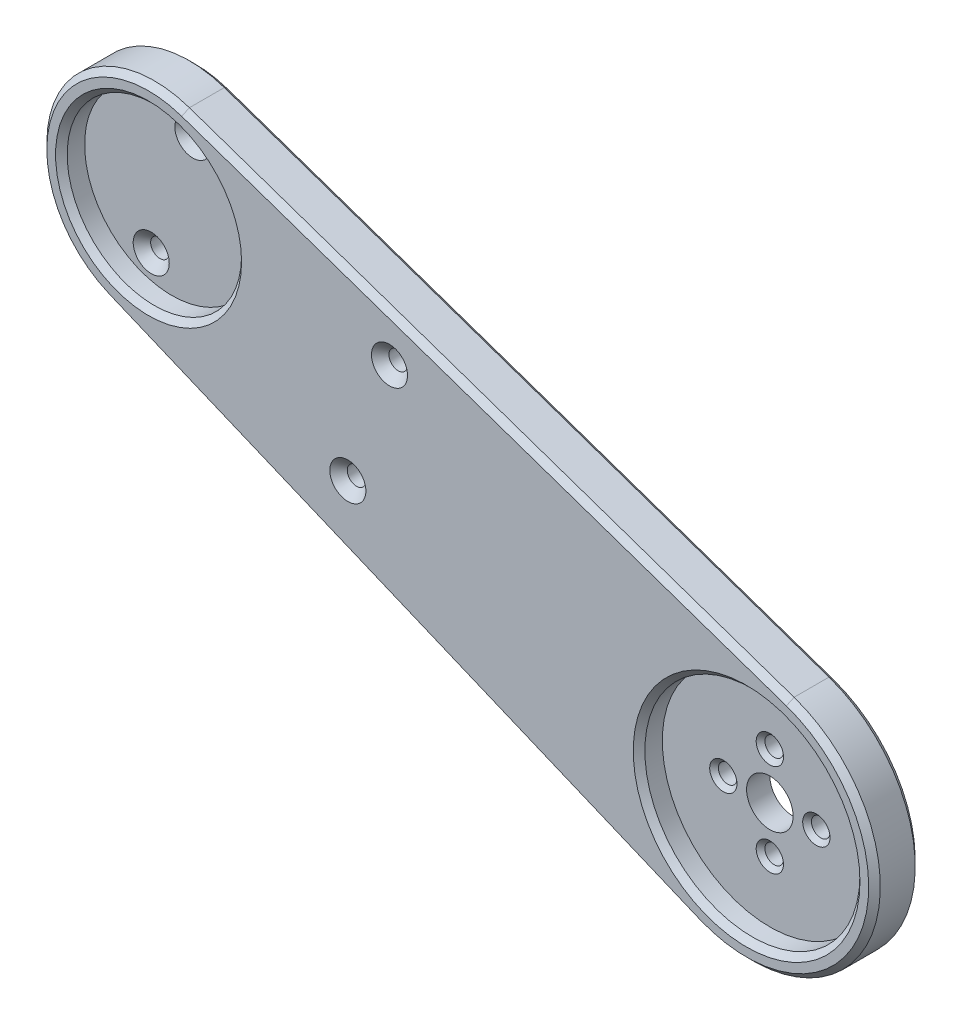
ISO-10303-21;
HEADER;
FILE_DESCRIPTION(('STEP AP214'),'2;1');
FILE_NAME('part.step','',(''),(''),'','','');
FILE_SCHEMA(('AUTOMOTIVE_DESIGN { 1 0 10303 214 1 1 1 1 }'));
ENDSEC;
DATA;
#1=APPLICATION_CONTEXT('core data for automotive mechanical design processes');
#2=APPLICATION_PROTOCOL_DEFINITION('international standard','automotive_design',2000,#1);
#3=PRODUCT_CONTEXT('',#1,'mechanical');
#4=PRODUCT('Part','Part','',(#3));
#5=PRODUCT_RELATED_PRODUCT_CATEGORY('part','',(#4));
#6=PRODUCT_DEFINITION_FORMATION('','',#4);
#7=PRODUCT_DEFINITION_CONTEXT('part definition',#1,'design');
#8=PRODUCT_DEFINITION('design','',#6,#7);
#9=PRODUCT_DEFINITION_SHAPE('','',#8);
#10=(LENGTH_UNIT() NAMED_UNIT(*) SI_UNIT(.MILLI.,.METRE.));
#11=(NAMED_UNIT(*) PLANE_ANGLE_UNIT() SI_UNIT($,.RADIAN.));
#12=(NAMED_UNIT(*) SI_UNIT($,.STERADIAN.) SOLID_ANGLE_UNIT());
#13=UNCERTAINTY_MEASURE_WITH_UNIT(LENGTH_MEASURE(1.E-05),#10,'distance_accuracy_value','');
#14=(GEOMETRIC_REPRESENTATION_CONTEXT(3) GLOBAL_UNCERTAINTY_ASSIGNED_CONTEXT((#13)) GLOBAL_UNIT_ASSIGNED_CONTEXT((#10,
#11,#12)) REPRESENTATION_CONTEXT('',''));
#15=CARTESIAN_POINT('',(0.,0.,0.));
#16=DIRECTION('',(0.,0.,1.));
#17=DIRECTION('',(1.,0.,0.));
#18=AXIS2_PLACEMENT_3D('',#15,#16,#17);
#19=CARTESIAN_POINT('',(0.,0.,8.));
#20=DIRECTION('',(0.,0.,1.));
#21=DIRECTION('',(1.,0.,0.));
#22=AXIS2_PLACEMENT_3D('',#19,#20,#21);
#23=PLANE('',#22);
#24=CARTESIAN_POINT('',(-78.1246934483278,29.8218290529631,8.));
#25=DIRECTION('',(0.,0.,1.));
#26=DIRECTION('',(1.,0.,0.));
#27=AXIS2_PLACEMENT_3D('',#24,#25,#26);
#28=CIRCLE('',#27,17.5);
#29=CARTESIAN_POINT('',(-72.4259671731648,46.3679621009222,8.));
#30=VERTEX_POINT('',#29);
#31=CARTESIAN_POINT('',(-84.863763479043,13.6714440692819,8.));
#32=VERTEX_POINT('',#31);
#33=EDGE_CURVE('E48',#30,#32,#28,.T.);
#34=ORIENTED_EDGE('',*,*,#33,.T.);
#35=DIRECTION('',(0.922879141924641,-0.38508971604087,0.));
#36=VECTOR('',#35,1.);
#37=CARTESIAN_POINT('',(16.6529421326675,-28.6884246952139,8.));
#38=LINE('',#37,#36);
#39=CARTESIAN_POINT('',(16.6529421326675,-28.6884246952139,8.));
#40=VERTEX_POINT('',#39);
#41=EDGE_CURVE('E11',#32,#40,#38,.T.);
#42=ORIENTED_EDGE('',*,*,#41,.T.);
#43=CARTESIAN_POINT('',(24.7398261695258,-9.3079627147964,8.));
#44=DIRECTION('',(0.,0.,1.));
#45=DIRECTION('',(1.,0.,0.));
#46=AXIS2_PLACEMENT_3D('',#43,#44,#45);
#47=CIRCLE('',#46,21.);
#48=CARTESIAN_POINT('',(31.5782976997214,10.5473969427546,8.));
#49=VERTEX_POINT('',#48);
#50=EDGE_CURVE('E137',#40,#49,#47,.T.);
#51=ORIENTED_EDGE('',*,*,#50,.T.);
#52=DIRECTION('',(-0.945493317026238,0.325641501437888,0.));
#53=VECTOR('',#52,1.);
#54=CARTESIAN_POINT('',(6.59609577821989,19.151626709845,8.));
#55=LINE('',#54,#53);
#56=EDGE_CURVE('E287',#49,#30,#55,.T.);
#57=ORIENTED_EDGE('',*,*,#56,.T.);
#58=EDGE_LOOP('',(#34,#42,#51,#57));
#59=FACE_BOUND('',#58,.T.);
#60=CARTESIAN_POINT('',(-36.6830568776465,27.1828714738999,8.));
#61=DIRECTION('',(0.,0.,1.));
#62=DIRECTION('',(1.,0.,0.));
#63=AXIS2_PLACEMENT_3D('',#60,#61,#62);
#64=CIRCLE('',#63,3.10000000000003);
#65=CARTESIAN_POINT('',(-33.5830568776465,27.1828714738999,8.));
#66=VERTEX_POINT('',#65);
#67=EDGE_CURVE('E261',#66,#66,#64,.F.);
#68=ORIENTED_EDGE('',*,*,#67,.T.);
#69=EDGE_LOOP('',(#68));
#70=FACE_BOUND('',#69,.T.);
#71=CARTESIAN_POINT('',(-43.84716990928,6.38201849932264,8.));
#72=DIRECTION('',(0.,0.,1.));
#73=DIRECTION('',(1.,0.,0.));
#74=AXIS2_PLACEMENT_3D('',#71,#72,#73);
#75=CIRCLE('',#74,3.10000000000001);
#76=CARTESIAN_POINT('',(-40.74716990928,6.38201849932264,8.));
#77=VERTEX_POINT('',#76);
#78=EDGE_CURVE('E258',#77,#77,#75,.F.);
#79=ORIENTED_EDGE('',*,*,#78,.T.);
#80=EDGE_LOOP('',(#79));
#81=FACE_BOUND('',#80,.T.);
#82=CARTESIAN_POINT('',(-78.1246934483278,29.8218290529631,8.));
#83=DIRECTION('',(0.,0.,1.));
#84=DIRECTION('',(1.,0.,0.));
#85=AXIS2_PLACEMENT_3D('',#82,#83,#84);
#86=CIRCLE('',#85,16.);
#87=CARTESIAN_POINT('',(-62.1246934483278,29.8218290529631,8.));
#88=VERTEX_POINT('',#87);
#89=EDGE_CURVE('E231',#88,#88,#86,.F.);
#90=ORIENTED_EDGE('',*,*,#89,.T.);
#91=EDGE_LOOP('',(#90));
#92=FACE_BOUND('',#91,.T.);
#93=CARTESIAN_POINT('',(24.7398261695258,-9.3079627147964,8.));
#94=DIRECTION('',(0.,0.,1.));
#95=DIRECTION('',(1.,0.,0.));
#96=AXIS2_PLACEMENT_3D('',#93,#94,#95);
#97=CIRCLE('',#96,19.5);
#98=CARTESIAN_POINT('',(44.2398261695258,-9.3079627147964,8.));
#99=VERTEX_POINT('',#98);
#100=EDGE_CURVE('E234',#99,#99,#97,.F.);
#101=ORIENTED_EDGE('',*,*,#100,.T.);
#102=EDGE_LOOP('',(#101));
#103=FACE_BOUND('',#102,.T.);
#104=ADVANCED_FACE('F38',(#59,#70,#81,#92,#103),#23,.T.);
#105=CARTESIAN_POINT('',(0.,0.,0.));
#106=DIRECTION('',(0.,0.,1.));
#107=DIRECTION('',(1.,0.,0.));
#108=AXIS2_PLACEMENT_3D('',#105,#106,#107);
#109=PLANE('',#108);
#110=CARTESIAN_POINT('',(24.7398261695258,-9.3079627147964,0.));
#111=DIRECTION('',(0.,0.,1.));
#112=DIRECTION('',(1.,0.,0.));
#113=AXIS2_PLACEMENT_3D('',#110,#111,#112);
#114=CIRCLE('',#113,21.);
#115=CARTESIAN_POINT('',(31.5782976997214,10.5473969427546,0.));
#116=VERTEX_POINT('',#115);
#117=CARTESIAN_POINT('',(16.6529421326675,-28.6884246952139,0.));
#118=VERTEX_POINT('',#117);
#119=EDGE_CURVE('E272',#116,#118,#114,.F.);
#120=ORIENTED_EDGE('',*,*,#119,.T.);
#121=DIRECTION('',(-0.922879141924641,0.38508971604087,0.));
#122=VECTOR('',#121,1.);
#123=CARTESIAN_POINT('',(-7.72608270276659,-18.5157906798303,0.));
#124=LINE('',#123,#122);
#125=CARTESIAN_POINT('',(-84.8637634790431,13.6714440692818,0.));
#126=VERTEX_POINT('',#125);
#127=EDGE_CURVE('E276',#118,#126,#124,.T.);
#128=ORIENTED_EDGE('',*,*,#127,.T.);
#129=CARTESIAN_POINT('',(-78.1246934483278,29.8218290529631,0.));
#130=DIRECTION('',(0.,0.,1.));
#131=DIRECTION('',(1.,0.,0.));
#132=AXIS2_PLACEMENT_3D('',#129,#130,#131);
#133=CIRCLE('',#132,17.5);
#134=CARTESIAN_POINT('',(-72.4259671731648,46.3679621009223,0.));
#135=VERTEX_POINT('',#134);
#136=EDGE_CURVE('E274',#126,#135,#133,.F.);
#137=ORIENTED_EDGE('',*,*,#136,.T.);
#138=DIRECTION('',(0.945493317026238,-0.325641501437888,0.));
#139=VECTOR('',#138,1.);
#140=CARTESIAN_POINT('',(31.5782976997214,10.5473969427546,0.));
#141=LINE('',#140,#139);
#142=EDGE_CURVE('E270',#135,#116,#141,.T.);
#143=ORIENTED_EDGE('',*,*,#142,.T.);
#144=EDGE_LOOP('',(#120,#128,#137,#143));
#145=FACE_BOUND('',#144,.T.);
#146=CARTESIAN_POINT('',(-74.502789558696,40.2085315314155,0.));
#147=DIRECTION('',(0.,0.,1.));
#148=DIRECTION('',(1.,0.,0.));
#149=AXIS2_PLACEMENT_3D('',#146,#147,#148);
#150=CIRCLE('',#149,1.6);
#151=CARTESIAN_POINT('',(-72.902789558696,40.2085315314155,0.));
#152=VERTEX_POINT('',#151);
#153=EDGE_CURVE('E168',#152,#152,#150,.T.);
#154=ORIENTED_EDGE('',*,*,#153,.T.);
#155=EDGE_LOOP('',(#154));
#156=FACE_BOUND('',#155,.T.);
#157=CARTESIAN_POINT('',(-43.84716990928,6.38201849932264,0.));
#158=DIRECTION('',(0.,0.,1.));
#159=DIRECTION('',(1.,0.,0.));
#160=AXIS2_PLACEMENT_3D('',#157,#158,#159);
#161=CIRCLE('',#160,1.6);
#162=CARTESIAN_POINT('',(-42.24716990928,6.38201849932264,0.));
#163=VERTEX_POINT('',#162);
#164=EDGE_CURVE('E173',#163,#163,#161,.T.);
#165=ORIENTED_EDGE('',*,*,#164,.T.);
#166=EDGE_LOOP('',(#165));
#167=FACE_BOUND('',#166,.T.);
#168=CARTESIAN_POINT('',(24.7398261695258,-9.3079627147964,0.));
#169=DIRECTION('',(0.,0.,-1.));
#170=DIRECTION('',(-1.,0.,0.));
#171=AXIS2_PLACEMENT_3D('',#168,#169,#170);
#172=CIRCLE('',#171,4.00000000000001);
#173=CARTESIAN_POINT('',(20.7398261695258,-9.3079627147964,0.));
#174=VERTEX_POINT('',#173);
#175=EDGE_CURVE('E176',#174,#174,#172,.T.);
#176=ORIENTED_EDGE('',*,*,#175,.F.);
#177=EDGE_LOOP('',(#176));
#178=FACE_BOUND('',#177,.T.);
#179=CARTESIAN_POINT('',(24.7398261695258,-1.3079627147964,0.));
#180=DIRECTION('',(0.,0.,1.));
#181=DIRECTION('',(1.,0.,0.));
#182=AXIS2_PLACEMENT_3D('',#179,#180,#181);
#183=CIRCLE('',#182,1.6);
#184=CARTESIAN_POINT('',(26.3398261695258,-1.3079627147964,0.));
#185=VERTEX_POINT('',#184);
#186=EDGE_CURVE('E181',#185,#185,#183,.T.);
#187=ORIENTED_EDGE('',*,*,#186,.T.);
#188=EDGE_LOOP('',(#187));
#189=FACE_BOUND('',#188,.T.);
#190=CARTESIAN_POINT('',(16.7398261695258,-9.30796271479641,0.));
#191=DIRECTION('',(0.,0.,1.));
#192=DIRECTION('',(1.,0.,0.));
#193=AXIS2_PLACEMENT_3D('',#190,#191,#192);
#194=CIRCLE('',#193,1.6);
#195=CARTESIAN_POINT('',(18.3398261695258,-9.30796271479641,0.));
#196=VERTEX_POINT('',#195);
#197=EDGE_CURVE('E184',#196,#196,#194,.T.);
#198=ORIENTED_EDGE('',*,*,#197,.T.);
#199=EDGE_LOOP('',(#198));
#200=FACE_BOUND('',#199,.T.);
#201=CARTESIAN_POINT('',(32.7398261695258,-9.3079627147964,0.));
#202=DIRECTION('',(0.,0.,1.));
#203=DIRECTION('',(1.,0.,0.));
#204=AXIS2_PLACEMENT_3D('',#201,#202,#203);
#205=CIRCLE('',#204,1.60000000000001);
#206=CARTESIAN_POINT('',(34.3398261695258,-9.3079627147964,0.));
#207=VERTEX_POINT('',#206);
#208=EDGE_CURVE('E187',#207,#207,#205,.T.);
#209=ORIENTED_EDGE('',*,*,#208,.T.);
#210=EDGE_LOOP('',(#209));
#211=FACE_BOUND('',#210,.T.);
#212=CARTESIAN_POINT('',(24.7398261695258,-17.3079627147964,0.));
#213=DIRECTION('',(0.,0.,1.));
#214=DIRECTION('',(1.,0.,0.));
#215=AXIS2_PLACEMENT_3D('',#212,#213,#214);
#216=CIRCLE('',#215,1.6);
#217=CARTESIAN_POINT('',(26.3398261695258,-17.3079627147964,0.));
#218=VERTEX_POINT('',#217);
#219=EDGE_CURVE('E190',#218,#218,#216,.T.);
#220=ORIENTED_EDGE('',*,*,#219,.T.);
#221=EDGE_LOOP('',(#220));
#222=FACE_BOUND('',#221,.T.);
#223=CARTESIAN_POINT('',(-81.6669025903295,19.4076785568382,0.));
#224=DIRECTION('',(0.,0.,1.));
#225=DIRECTION('',(1.,0.,0.));
#226=AXIS2_PLACEMENT_3D('',#223,#224,#225);
#227=CIRCLE('',#226,1.6);
#228=CARTESIAN_POINT('',(-80.0669025903295,19.4076785568382,0.));
#229=VERTEX_POINT('',#228);
#230=EDGE_CURVE('E162',#229,#229,#227,.F.);
#231=ORIENTED_EDGE('',*,*,#230,.F.);
#232=EDGE_LOOP('',(#231));
#233=FACE_BOUND('',#232,.T.);
#234=CARTESIAN_POINT('',(-36.6830568776465,27.1828714738999,0.));
#235=DIRECTION('',(0.,0.,1.));
#236=DIRECTION('',(1.,0.,0.));
#237=AXIS2_PLACEMENT_3D('',#234,#235,#236);
#238=CIRCLE('',#237,1.6);
#239=CARTESIAN_POINT('',(-35.0830568776465,27.1828714738999,0.));
#240=VERTEX_POINT('',#239);
#241=EDGE_CURVE('E180',#240,#240,#238,.F.);
#242=ORIENTED_EDGE('',*,*,#241,.F.);
#243=EDGE_LOOP('',(#242));
#244=FACE_BOUND('',#243,.T.);
#245=ADVANCED_FACE('F317',(#145,#156,#167,#178,#189,#200,#211,#222,#233,#244),#109,.F.);
#246=CARTESIAN_POINT('',(0.,0.,4.));
#247=DIRECTION('',(0.,0.,1.));
#248=DIRECTION('',(1.,0.,0.));
#249=AXIS2_PLACEMENT_3D('',#246,#247,#248);
#250=PLANE('',#249);
#251=CARTESIAN_POINT('',(-74.502789558696,40.2085315314155,4.));
#252=DIRECTION('',(0.,0.,1.));
#253=DIRECTION('',(1.,0.,0.));
#254=AXIS2_PLACEMENT_3D('',#251,#252,#253);
#255=CIRCLE('',#254,3.10000000000002);
#256=CARTESIAN_POINT('',(-71.4027895586959,40.2085315314155,4.));
#257=VERTEX_POINT('',#256);
#258=EDGE_CURVE('E252',#257,#257,#255,.F.);
#259=ORIENTED_EDGE('',*,*,#258,.T.);
#260=EDGE_LOOP('',(#259));
#261=FACE_BOUND('',#260,.T.);
#262=CARTESIAN_POINT('',(-81.6669025903295,19.4076785568382,4.));
#263=DIRECTION('',(0.,0.,1.));
#264=DIRECTION('',(1.,0.,0.));
#265=AXIS2_PLACEMENT_3D('',#262,#263,#264);
#266=CIRCLE('',#265,3.10000000000001);
#267=CARTESIAN_POINT('',(-78.5669025903295,19.4076785568382,4.));
#268=VERTEX_POINT('',#267);
#269=EDGE_CURVE('E249',#268,#268,#266,.F.);
#270=ORIENTED_EDGE('',*,*,#269,.T.);
#271=EDGE_LOOP('',(#270));
#272=FACE_BOUND('',#271,.T.);
#273=CARTESIAN_POINT('',(-78.1246934483278,29.8218290529631,4.));
#274=DIRECTION('',(0.,0.,1.));
#275=DIRECTION('',(1.,0.,0.));
#276=AXIS2_PLACEMENT_3D('',#273,#274,#275);
#277=CIRCLE('',#276,15.);
#278=CARTESIAN_POINT('',(-63.1246934483278,29.8218290529631,4.));
#279=VERTEX_POINT('',#278);
#280=EDGE_CURVE('E201',#279,#279,#277,.T.);
#281=ORIENTED_EDGE('',*,*,#280,.T.);
#282=EDGE_LOOP('',(#281));
#283=FACE_BOUND('',#282,.T.);
#284=ADVANCED_FACE('F322',(#261,#272,#283),#250,.T.);
#285=CARTESIAN_POINT('',(-8.11117241880745,-19.4386698217549,8.));
#286=DIRECTION('',(0.38508971604087,0.922879141924641,0.));
#287=DIRECTION('',(-0.922879141924641,0.38508971604087,0.));
#288=AXIS2_PLACEMENT_3D('',#285,#286,#287);
#289=PLANE('',#288);
#290=DIRECTION('',(0.,0.,-1.));
#291=VECTOR('',#290,1.);
#292=CARTESIAN_POINT('',(-85.2488531950839,12.7485649273572,8.));
#293=LINE('',#292,#291);
#294=CARTESIAN_POINT('',(-85.2488531950839,12.7485649273572,6.99999999999999));
#295=VERTEX_POINT('',#294);
#296=CARTESIAN_POINT('',(-85.2488531950839,12.7485649273572,0.999999999999973));
#297=VERTEX_POINT('',#296);
#298=EDGE_CURVE('E193',#295,#297,#293,.T.);
#299=ORIENTED_EDGE('',*,*,#298,.T.);
#300=DIRECTION('',(0.922879141924641,-0.38508971604087,0.));
#301=VECTOR('',#300,1.);
#302=CARTESIAN_POINT('',(-8.11117241880745,-19.4386698217549,0.999999999999975));
#303=LINE('',#302,#301);
#304=CARTESIAN_POINT('',(16.2678524166266,-29.6113038371385,0.999999999999973));
#305=VERTEX_POINT('',#304);
#306=EDGE_CURVE('E128',#297,#305,#303,.T.);
#307=ORIENTED_EDGE('',*,*,#306,.T.);
#308=DIRECTION('',(0.,0.,-1.));
#309=VECTOR('',#308,1.);
#310=CARTESIAN_POINT('',(16.2678524166266,-29.6113038371385,8.));
#311=LINE('',#310,#309);
#312=CARTESIAN_POINT('',(16.2678524166266,-29.6113038371385,6.99999999999999));
#313=VERTEX_POINT('',#312);
#314=EDGE_CURVE('E111',#313,#305,#311,.T.);
#315=ORIENTED_EDGE('',*,*,#314,.F.);
#316=DIRECTION('',(-0.922879141924641,0.38508971604087,0.));
#317=VECTOR('',#316,1.);
#318=CARTESIAN_POINT('',(-85.2488531950839,12.7485649273572,6.99999999999998));
#319=LINE('',#318,#317);
#320=EDGE_CURVE('E125',#313,#295,#319,.T.);
#321=ORIENTED_EDGE('',*,*,#320,.T.);
#322=EDGE_LOOP('',(#299,#307,#315,#321));
#323=FACE_BOUND('',#322,.T.);
#324=ADVANCED_FACE('F124',(#323),#289,.F.);
#325=CARTESIAN_POINT('',(24.7398261695258,-9.3079627147964,8.));
#326=DIRECTION('',(0.,0.,-1.));
#327=DIRECTION('',(-1.,0.,0.));
#328=AXIS2_PLACEMENT_3D('',#325,#326,#327);
#329=CYLINDRICAL_SURFACE('',#328,22.);
#330=ORIENTED_EDGE('',*,*,#314,.T.);
#331=CARTESIAN_POINT('',(24.7398261695258,-9.3079627147964,0.999999999999973));
#332=DIRECTION('',(0.,0.,1.));
#333=DIRECTION('',(1.,0.,0.));
#334=AXIS2_PLACEMENT_3D('',#331,#332,#333);
#335=CIRCLE('',#334,22.);
#336=CARTESIAN_POINT('',(31.9039392011593,11.4928902597808,0.999999999999973));
#337=VERTEX_POINT('',#336);
#338=EDGE_CURVE('E117',#305,#337,#335,.T.);
#339=ORIENTED_EDGE('',*,*,#338,.T.);
#340=DIRECTION('',(0.,0.,-1.));
#341=VECTOR('',#340,1.);
#342=CARTESIAN_POINT('',(31.9039392011593,11.4928902597808,8.));
#343=LINE('',#342,#341);
#344=CARTESIAN_POINT('',(31.9039392011593,11.4928902597808,6.99999999999998));
#345=VERTEX_POINT('',#344);
#346=EDGE_CURVE('E113',#345,#337,#343,.T.);
#347=ORIENTED_EDGE('',*,*,#346,.F.);
#348=CARTESIAN_POINT('',(24.7398261695258,-9.3079627147964,6.99999999999999));
#349=DIRECTION('',(0.,0.,1.));
#350=DIRECTION('',(1.,0.,0.));
#351=AXIS2_PLACEMENT_3D('',#348,#349,#350);
#352=CIRCLE('',#351,22.);
#353=EDGE_CURVE('E108',#345,#313,#352,.F.);
#354=ORIENTED_EDGE('',*,*,#353,.T.);
#355=EDGE_LOOP('',(#330,#339,#347,#354));
#356=FACE_BOUND('',#355,.T.);
#357=ADVANCED_FACE('F110',(#356),#329,.T.);
#358=CARTESIAN_POINT('',(6.92173727965778,20.0971200268713,8.));
#359=DIRECTION('',(0.325641501437888,0.945493317026238,0.));
#360=DIRECTION('',(-0.945493317026238,0.325641501437888,0.));
#361=AXIS2_PLACEMENT_3D('',#358,#359,#360);
#362=PLANE('',#361);
#363=ORIENTED_EDGE('',*,*,#346,.T.);
#364=DIRECTION('',(-0.945493317026238,0.325641501437888,0.));
#365=VECTOR('',#364,1.);
#366=CARTESIAN_POINT('',(-72.1003256717269,47.3134554179485,0.999999999999973));
#367=LINE('',#366,#365);
#368=CARTESIAN_POINT('',(-72.1003256717269,47.3134554179485,0.999999999999973));
#369=VERTEX_POINT('',#368);
#370=EDGE_CURVE('E285',#337,#369,#367,.T.);
#371=ORIENTED_EDGE('',*,*,#370,.T.);
#372=DIRECTION('',(0.,0.,-1.));
#373=VECTOR('',#372,1.);
#374=CARTESIAN_POINT('',(-72.1003256717269,47.3134554179485,8.));
#375=LINE('',#374,#373);
#376=CARTESIAN_POINT('',(-72.1003256717269,47.3134554179485,6.99999999999998));
#377=VERTEX_POINT('',#376);
#378=EDGE_CURVE('E195',#377,#369,#375,.T.);
#379=ORIENTED_EDGE('',*,*,#378,.F.);
#380=DIRECTION('',(0.945493317026238,-0.325641501437888,0.));
#381=VECTOR('',#380,1.);
#382=CARTESIAN_POINT('',(6.92173727965778,20.0971200268713,6.99999999999998));
#383=LINE('',#382,#381);
#384=EDGE_CURVE('E283',#377,#345,#383,.T.);
#385=ORIENTED_EDGE('',*,*,#384,.T.);
#386=EDGE_LOOP('',(#363,#371,#379,#385));
#387=FACE_BOUND('',#386,.T.);
#388=ADVANCED_FACE('F298',(#387),#362,.T.);
#389=CARTESIAN_POINT('',(24.7398261695258,-9.3079627147964,8.));
#390=DIRECTION('',(0.,0.,-1.));
#391=DIRECTION('',(-1.,0.,0.));
#392=AXIS2_PLACEMENT_3D('',#389,#390,#391);
#393=CYLINDRICAL_SURFACE('',#392,18.5);
#394=CARTESIAN_POINT('',(24.7398261695258,-9.3079627147964,6.99999999999998));
#395=DIRECTION('',(0.,0.,1.));
#396=DIRECTION('',(1.,0.,0.));
#397=AXIS2_PLACEMENT_3D('',#394,#395,#396);
#398=CIRCLE('',#397,18.5);
#399=CARTESIAN_POINT('',(43.2398261695258,-9.3079627147964,6.99999999999998));
#400=VERTEX_POINT('',#399);
#401=EDGE_CURVE('E228',#400,#400,#398,.T.);
#402=ORIENTED_EDGE('',*,*,#401,.T.);
#403=EDGE_LOOP('',(#402));
#404=FACE_BOUND('',#403,.T.);
#405=CARTESIAN_POINT('',(24.7398261695258,-9.3079627147964,4.));
#406=DIRECTION('',(0.,0.,1.));
#407=DIRECTION('',(1.,0.,0.));
#408=AXIS2_PLACEMENT_3D('',#405,#406,#407);
#409=CIRCLE('',#408,18.5);
#410=CARTESIAN_POINT('',(43.2398261695258,-9.3079627147964,4.));
#411=VERTEX_POINT('',#410);
#412=EDGE_CURVE('E129',#411,#411,#409,.T.);
#413=ORIENTED_EDGE('',*,*,#412,.F.);
#414=EDGE_LOOP('',(#413));
#415=FACE_BOUND('',#414,.T.);
#416=ADVANCED_FACE('F335',(#404,#415),#393,.F.);
#417=CARTESIAN_POINT('',(-78.1246934483278,29.8218290529631,8.));
#418=DIRECTION('',(0.,0.,-1.));
#419=DIRECTION('',(-1.,0.,0.));
#420=AXIS2_PLACEMENT_3D('',#417,#418,#419);
#421=CYLINDRICAL_SURFACE('',#420,15.);
#422=CARTESIAN_POINT('',(-78.1246934483278,29.8218290529631,6.99999999999999));
#423=DIRECTION('',(0.,0.,1.));
#424=DIRECTION('',(1.,0.,0.));
#425=AXIS2_PLACEMENT_3D('',#422,#423,#424);
#426=CIRCLE('',#425,15.);
#427=CARTESIAN_POINT('',(-63.1246934483278,29.8218290529631,6.99999999999999));
#428=VERTEX_POINT('',#427);
#429=EDGE_CURVE('E237',#428,#428,#426,.T.);
#430=ORIENTED_EDGE('',*,*,#429,.T.);
#431=EDGE_LOOP('',(#430));
#432=FACE_BOUND('',#431,.T.);
#433=ORIENTED_EDGE('',*,*,#280,.F.);
#434=EDGE_LOOP('',(#433));
#435=FACE_BOUND('',#434,.T.);
#436=ADVANCED_FACE('F332',(#432,#435),#421,.F.);
#437=CARTESIAN_POINT('',(-78.1246934483278,29.8218290529631,8.));
#438=DIRECTION('',(0.,0.,-1.));
#439=DIRECTION('',(-1.,0.,0.));
#440=AXIS2_PLACEMENT_3D('',#437,#438,#439);
#441=CYLINDRICAL_SURFACE('',#440,18.5);
#442=ORIENTED_EDGE('',*,*,#378,.T.);
#443=CARTESIAN_POINT('',(-78.1246934483278,29.8218290529631,0.999999999999973));
#444=DIRECTION('',(0.,0.,1.));
#445=DIRECTION('',(1.,0.,0.));
#446=AXIS2_PLACEMENT_3D('',#443,#444,#445);
#447=CIRCLE('',#446,18.5);
#448=EDGE_CURVE('E118',#369,#297,#447,.T.);
#449=ORIENTED_EDGE('',*,*,#448,.T.);
#450=ORIENTED_EDGE('',*,*,#298,.F.);
#451=CARTESIAN_POINT('',(-78.1246934483278,29.8218290529631,6.99999999999999));
#452=DIRECTION('',(0.,0.,1.));
#453=DIRECTION('',(1.,0.,0.));
#454=AXIS2_PLACEMENT_3D('',#451,#452,#453);
#455=CIRCLE('',#454,18.5);
#456=EDGE_CURVE('E279',#295,#377,#455,.F.);
#457=ORIENTED_EDGE('',*,*,#456,.T.);
#458=EDGE_LOOP('',(#442,#449,#450,#457));
#459=FACE_BOUND('',#458,.T.);
#460=ADVANCED_FACE('F296',(#459),#441,.T.);
#461=CARTESIAN_POINT('',(24.7398261695258,-17.3079627147964,4.));
#462=DIRECTION('',(0.,0.,-1.));
#463=DIRECTION('',(-1.,0.,0.));
#464=AXIS2_PLACEMENT_3D('',#461,#462,#463);
#465=CYLINDRICAL_SURFACE('',#464,1.6);
#466=CARTESIAN_POINT('',(24.7398261695258,-17.3079627147964,3.24999999999998));
#467=DIRECTION('',(0.,0.,1.));
#468=DIRECTION('',(1.,0.,0.));
#469=AXIS2_PLACEMENT_3D('',#466,#467,#468);
#470=CIRCLE('',#469,1.6);
#471=CARTESIAN_POINT('',(26.3398261695258,-17.3079627147964,3.24999999999998));
#472=VERTEX_POINT('',#471);
#473=EDGE_CURVE('E219',#472,#472,#470,.T.);
#474=ORIENTED_EDGE('',*,*,#473,.T.);
#475=EDGE_LOOP('',(#474));
#476=FACE_BOUND('',#475,.T.);
#477=ORIENTED_EDGE('',*,*,#219,.F.);
#478=EDGE_LOOP('',(#477));
#479=FACE_BOUND('',#478,.T.);
#480=ADVANCED_FACE('F331',(#476,#479),#465,.F.);
#481=CARTESIAN_POINT('',(32.7398261695258,-9.3079627147964,4.));
#482=DIRECTION('',(0.,0.,-1.));
#483=DIRECTION('',(-1.,0.,0.));
#484=AXIS2_PLACEMENT_3D('',#481,#482,#483);
#485=CYLINDRICAL_SURFACE('',#484,1.60000000000001);
#486=CARTESIAN_POINT('',(32.7398261695258,-9.3079627147964,3.24999999999999));
#487=DIRECTION('',(0.,0.,1.));
#488=DIRECTION('',(1.,0.,0.));
#489=AXIS2_PLACEMENT_3D('',#486,#487,#488);
#490=CIRCLE('',#489,1.60000000000001);
#491=CARTESIAN_POINT('',(34.3398261695258,-9.3079627147964,3.24999999999999));
#492=VERTEX_POINT('',#491);
#493=EDGE_CURVE('E222',#492,#492,#490,.T.);
#494=ORIENTED_EDGE('',*,*,#493,.T.);
#495=EDGE_LOOP('',(#494));
#496=FACE_BOUND('',#495,.T.);
#497=ORIENTED_EDGE('',*,*,#208,.F.);
#498=EDGE_LOOP('',(#497));
#499=FACE_BOUND('',#498,.T.);
#500=ADVANCED_FACE('F442',(#496,#499),#485,.F.);
#501=CARTESIAN_POINT('',(16.7398261695258,-9.30796271479641,4.));
#502=DIRECTION('',(0.,0.,-1.));
#503=DIRECTION('',(-1.,0.,0.));
#504=AXIS2_PLACEMENT_3D('',#501,#502,#503);
#505=CYLINDRICAL_SURFACE('',#504,1.6);
#506=CARTESIAN_POINT('',(16.7398261695258,-9.30796271479641,3.24999999999997));
#507=DIRECTION('',(0.,0.,1.));
#508=DIRECTION('',(1.,0.,0.));
#509=AXIS2_PLACEMENT_3D('',#506,#507,#508);
#510=CIRCLE('',#509,1.6);
#511=CARTESIAN_POINT('',(18.3398261695258,-9.30796271479641,3.24999999999997));
#512=VERTEX_POINT('',#511);
#513=EDGE_CURVE('E204',#512,#512,#510,.T.);
#514=ORIENTED_EDGE('',*,*,#513,.T.);
#515=EDGE_LOOP('',(#514));
#516=FACE_BOUND('',#515,.T.);
#517=ORIENTED_EDGE('',*,*,#197,.F.);
#518=EDGE_LOOP('',(#517));
#519=FACE_BOUND('',#518,.T.);
#520=ADVANCED_FACE('F445',(#516,#519),#505,.F.);
#521=CARTESIAN_POINT('',(24.7398261695258,-1.3079627147964,4.));
#522=DIRECTION('',(0.,0.,-1.));
#523=DIRECTION('',(-1.,0.,0.));
#524=AXIS2_PLACEMENT_3D('',#521,#522,#523);
#525=CYLINDRICAL_SURFACE('',#524,1.6);
#526=CARTESIAN_POINT('',(24.7398261695258,-1.3079627147964,3.24999999999995));
#527=DIRECTION('',(0.,0.,1.));
#528=DIRECTION('',(1.,0.,0.));
#529=AXIS2_PLACEMENT_3D('',#526,#527,#528);
#530=CIRCLE('',#529,1.6);
#531=CARTESIAN_POINT('',(26.3398261695258,-1.3079627147964,3.24999999999995));
#532=VERTEX_POINT('',#531);
#533=EDGE_CURVE('E225',#532,#532,#530,.T.);
#534=ORIENTED_EDGE('',*,*,#533,.T.);
#535=EDGE_LOOP('',(#534));
#536=FACE_BOUND('',#535,.T.);
#537=ORIENTED_EDGE('',*,*,#186,.F.);
#538=EDGE_LOOP('',(#537));
#539=FACE_BOUND('',#538,.T.);
#540=ADVANCED_FACE('F326',(#536,#539),#525,.F.);
#541=CARTESIAN_POINT('',(0.,0.,4.));
#542=DIRECTION('',(0.,0.,1.));
#543=DIRECTION('',(1.,0.,0.));
#544=AXIS2_PLACEMENT_3D('',#541,#542,#543);
#545=PLANE('',#544);
#546=CARTESIAN_POINT('',(24.7398261695258,-9.3079627147964,4.));
#547=DIRECTION('',(0.,0.,1.));
#548=DIRECTION('',(1.,0.,0.));
#549=AXIS2_PLACEMENT_3D('',#546,#547,#548);
#550=CIRCLE('',#549,4.00000000000001);
#551=CARTESIAN_POINT('',(28.7398261695258,-9.3079627147964,4.));
#552=VERTEX_POINT('',#551);
#553=EDGE_CURVE('E179',#552,#552,#550,.T.);
#554=ORIENTED_EDGE('',*,*,#553,.F.);
#555=EDGE_LOOP('',(#554));
#556=FACE_BOUND('',#555,.T.);
#557=CARTESIAN_POINT('',(16.7398261695258,-9.30796271479641,4.));
#558=DIRECTION('',(0.,0.,1.));
#559=DIRECTION('',(1.,0.,0.));
#560=AXIS2_PLACEMENT_3D('',#557,#558,#559);
#561=CIRCLE('',#560,2.35000000000003);
#562=CARTESIAN_POINT('',(19.0898261695258,-9.30796271479641,4.));
#563=VERTEX_POINT('',#562);
#564=EDGE_CURVE('E216',#563,#563,#561,.F.);
#565=ORIENTED_EDGE('',*,*,#564,.T.);
#566=EDGE_LOOP('',(#565));
#567=FACE_BOUND('',#566,.T.);
#568=CARTESIAN_POINT('',(24.7398261695258,-17.3079627147964,4.));
#569=DIRECTION('',(0.,0.,1.));
#570=DIRECTION('',(1.,0.,0.));
#571=AXIS2_PLACEMENT_3D('',#568,#569,#570);
#572=CIRCLE('',#571,2.35000000000003);
#573=CARTESIAN_POINT('',(27.0898261695258,-17.3079627147964,4.));
#574=VERTEX_POINT('',#573);
#575=EDGE_CURVE('E213',#574,#574,#572,.F.);
#576=ORIENTED_EDGE('',*,*,#575,.T.);
#577=EDGE_LOOP('',(#576));
#578=FACE_BOUND('',#577,.T.);
#579=CARTESIAN_POINT('',(32.7398261695258,-9.3079627147964,4.));
#580=DIRECTION('',(0.,0.,1.));
#581=DIRECTION('',(1.,0.,0.));
#582=AXIS2_PLACEMENT_3D('',#579,#580,#581);
#583=CIRCLE('',#582,2.35000000000003);
#584=CARTESIAN_POINT('',(35.0898261695258,-9.3079627147964,4.));
#585=VERTEX_POINT('',#584);
#586=EDGE_CURVE('E210',#585,#585,#583,.F.);
#587=ORIENTED_EDGE('',*,*,#586,.T.);
#588=EDGE_LOOP('',(#587));
#589=FACE_BOUND('',#588,.T.);
#590=CARTESIAN_POINT('',(24.7398261695258,-1.3079627147964,4.));
#591=DIRECTION('',(0.,0.,1.));
#592=DIRECTION('',(1.,0.,0.));
#593=AXIS2_PLACEMENT_3D('',#590,#591,#592);
#594=CIRCLE('',#593,2.35000000000005);
#595=CARTESIAN_POINT('',(27.0898261695258,-1.3079627147964,4.));
#596=VERTEX_POINT('',#595);
#597=EDGE_CURVE('E207',#596,#596,#594,.F.);
#598=ORIENTED_EDGE('',*,*,#597,.T.);
#599=EDGE_LOOP('',(#598));
#600=FACE_BOUND('',#599,.T.);
#601=ORIENTED_EDGE('',*,*,#412,.T.);
#602=EDGE_LOOP('',(#601));
#603=FACE_BOUND('',#602,.T.);
#604=ADVANCED_FACE('F354',(#556,#567,#578,#589,#600,#603),#545,.T.);
#605=CARTESIAN_POINT('',(16.7398261695258,-9.30796271479641,3.24999999999997));
#606=DIRECTION('',(0.,0.,1.));
#607=DIRECTION('',(1.,0.,0.));
#608=AXIS2_PLACEMENT_3D('',#605,#606,#607);
#609=CONICAL_SURFACE('',#608,1.6,0.785398163397454);
#610=ORIENTED_EDGE('',*,*,#564,.F.);
#611=EDGE_LOOP('',(#610));
#612=FACE_BOUND('',#611,.T.);
#613=ORIENTED_EDGE('',*,*,#513,.F.);
#614=EDGE_LOOP('',(#613));
#615=FACE_BOUND('',#614,.T.);
#616=ADVANCED_FACE('F347',(#612,#615),#609,.F.);
#617=CARTESIAN_POINT('',(24.7398261695258,-17.3079627147964,3.24999999999998));
#618=DIRECTION('',(0.,0.,1.));
#619=DIRECTION('',(1.,0.,0.));
#620=AXIS2_PLACEMENT_3D('',#617,#618,#619);
#621=CONICAL_SURFACE('',#620,1.6,0.785398163397454);
#622=ORIENTED_EDGE('',*,*,#575,.F.);
#623=EDGE_LOOP('',(#622));
#624=FACE_BOUND('',#623,.T.);
#625=ORIENTED_EDGE('',*,*,#473,.F.);
#626=EDGE_LOOP('',(#625));
#627=FACE_BOUND('',#626,.T.);
#628=ADVANCED_FACE('F353',(#624,#627),#621,.F.);
#629=CARTESIAN_POINT('',(32.7398261695258,-9.3079627147964,3.24999999999999));
#630=DIRECTION('',(0.,0.,1.));
#631=DIRECTION('',(1.,0.,0.));
#632=AXIS2_PLACEMENT_3D('',#629,#630,#631);
#633=CONICAL_SURFACE('',#632,1.60000000000001,0.785398163397454);
#634=CARTESIAN_POINT('',(35.0898261695258,-9.3079627147964,4.));
#635=CARTESIAN_POINT('',(35.0820136695258,-9.3079627147964,3.9921875));
#636=CARTESIAN_POINT('',(35.0742011695258,-9.3079627147964,3.984375));
#637=CARTESIAN_POINT('',(35.0585761695258,-9.3079627147964,3.96875));
#638=CARTESIAN_POINT('',(35.0507636695258,-9.3079627147964,3.9609375));
#639=CARTESIAN_POINT('',(35.0351386695258,-9.3079627147964,3.9453125));
#640=CARTESIAN_POINT('',(35.0273261695258,-9.3079627147964,3.9375));
#641=CARTESIAN_POINT('',(35.0117011695258,-9.3079627147964,3.921875));
#642=CARTESIAN_POINT('',(35.0038886695258,-9.3079627147964,3.9140625));
#643=CARTESIAN_POINT('',(34.9882636695258,-9.3079627147964,3.8984375));
#644=CARTESIAN_POINT('',(34.9804511695258,-9.3079627147964,3.890625));
#645=CARTESIAN_POINT('',(34.9648261695258,-9.3079627147964,3.875));
#646=CARTESIAN_POINT('',(34.9570136695258,-9.3079627147964,3.8671875));
#647=CARTESIAN_POINT('',(34.9413886695258,-9.3079627147964,3.8515625));
#648=CARTESIAN_POINT('',(34.9335761695258,-9.3079627147964,3.84375));
#649=CARTESIAN_POINT('',(34.9179511695258,-9.3079627147964,3.828125));
#650=CARTESIAN_POINT('',(34.9101386695258,-9.3079627147964,3.8203125));
#651=CARTESIAN_POINT('',(34.8945136695258,-9.3079627147964,3.8046875));
#652=CARTESIAN_POINT('',(34.8867011695258,-9.3079627147964,3.796875));
#653=CARTESIAN_POINT('',(34.8710761695258,-9.3079627147964,3.78125));
#654=CARTESIAN_POINT('',(34.8632636695258,-9.3079627147964,3.7734375));
#655=CARTESIAN_POINT('',(34.8476386695258,-9.3079627147964,3.7578125));
#656=CARTESIAN_POINT('',(34.8398261695258,-9.3079627147964,3.75));
#657=CARTESIAN_POINT('',(34.8242011695258,-9.3079627147964,3.734375));
#658=CARTESIAN_POINT('',(34.8163886695258,-9.3079627147964,3.7265625));
#659=CARTESIAN_POINT('',(34.8007636695258,-9.3079627147964,3.7109375));
#660=CARTESIAN_POINT('',(34.7929511695258,-9.3079627147964,3.703125));
#661=CARTESIAN_POINT('',(34.7773261695258,-9.3079627147964,3.6875));
#662=CARTESIAN_POINT('',(34.7695136695258,-9.3079627147964,3.67968749999999));
#663=CARTESIAN_POINT('',(34.7538886695258,-9.3079627147964,3.66406249999999));
#664=CARTESIAN_POINT('',(34.7460761695258,-9.3079627147964,3.65624999999999));
#665=CARTESIAN_POINT('',(34.7304511695258,-9.3079627147964,3.64062499999999));
#666=CARTESIAN_POINT('',(34.7226386695258,-9.3079627147964,3.63281249999999));
#667=CARTESIAN_POINT('',(34.7070136695258,-9.3079627147964,3.61718749999999));
#668=CARTESIAN_POINT('',(34.6992011695258,-9.3079627147964,3.60937499999999));
#669=CARTESIAN_POINT('',(34.6835761695258,-9.3079627147964,3.59374999999999));
#670=CARTESIAN_POINT('',(34.6757636695258,-9.3079627147964,3.58593749999999));
#671=CARTESIAN_POINT('',(34.6601386695258,-9.3079627147964,3.57031249999999));
#672=CARTESIAN_POINT('',(34.6523261695258,-9.3079627147964,3.56249999999999));
#673=CARTESIAN_POINT('',(34.6367011695258,-9.3079627147964,3.54687499999999));
#674=CARTESIAN_POINT('',(34.6288886695258,-9.3079627147964,3.53906249999999));
#675=CARTESIAN_POINT('',(34.6132636695258,-9.3079627147964,3.52343749999999));
#676=CARTESIAN_POINT('',(34.6054511695258,-9.3079627147964,3.51562499999999));
#677=CARTESIAN_POINT('',(34.5898261695258,-9.3079627147964,3.49999999999999));
#678=CARTESIAN_POINT('',(34.5820136695258,-9.3079627147964,3.49218749999999));
#679=CARTESIAN_POINT('',(34.5663886695258,-9.3079627147964,3.47656249999999));
#680=CARTESIAN_POINT('',(34.5585761695258,-9.3079627147964,3.46874999999999));
#681=CARTESIAN_POINT('',(34.5429511695258,-9.3079627147964,3.45312499999999));
#682=CARTESIAN_POINT('',(34.5351386695258,-9.3079627147964,3.44531249999999));
#683=CARTESIAN_POINT('',(34.5195136695258,-9.3079627147964,3.42968749999999));
#684=CARTESIAN_POINT('',(34.5117011695258,-9.3079627147964,3.42187499999999));
#685=CARTESIAN_POINT('',(34.4960761695258,-9.3079627147964,3.40624999999999));
#686=CARTESIAN_POINT('',(34.4882636695258,-9.3079627147964,3.39843749999999));
#687=CARTESIAN_POINT('',(34.4726386695258,-9.3079627147964,3.38281249999999));
#688=CARTESIAN_POINT('',(34.4648261695258,-9.3079627147964,3.37499999999999));
#689=CARTESIAN_POINT('',(34.4492011695258,-9.3079627147964,3.35937499999999));
#690=CARTESIAN_POINT('',(34.4413886695258,-9.3079627147964,3.35156249999999));
#691=CARTESIAN_POINT('',(34.4257636695258,-9.3079627147964,3.33593749999999));
#692=CARTESIAN_POINT('',(34.4179511695258,-9.3079627147964,3.32812499999999));
#693=CARTESIAN_POINT('',(34.4023261695258,-9.3079627147964,3.31249999999999));
#694=CARTESIAN_POINT('',(34.3945136695258,-9.3079627147964,3.30468749999999));
#695=CARTESIAN_POINT('',(34.3788886695258,-9.3079627147964,3.28906249999999));
#696=CARTESIAN_POINT('',(34.3710761695258,-9.3079627147964,3.28124999999999));
#697=CARTESIAN_POINT('',(34.3554511695258,-9.3079627147964,3.26562499999999));
#698=CARTESIAN_POINT('',(34.3476386695258,-9.3079627147964,3.25781249999999));
#699=CARTESIAN_POINT('',(34.3398261695258,-9.3079627147964,3.24999999999999));
#700=B_SPLINE_CURVE_WITH_KNOTS('',3,(#634,#635,#636,#637,#638,#639,#640,#641,#642,#643,#644,
#645,#646,#647,#648,#649,#650,#651,#652,#653,#654,#655,#656,#657,#658,#659,#660,#661,#662,#663,
#664,#665,#666,#667,#668,#669,#670,#671,#672,#673,#674,#675,#676,#677,#678,#679,#680,#681,#682,
#683,#684,#685,#686,#687,#688,#689,#690,#691,#692,#693,#694,#695,#696,#697,#698,#699),
.UNSPECIFIED.,.F.,.F.,(4,2,2,2,2,2,2,2,2,2,2,2,2,2,2,2,2,2,2,2,2,2,2,2,2,2,2,2,2,2,2,2,4),(0.,
0.0331456303681201,0.0662912607362401,0.0994368911043608,0.132582521472481,0.165728151840601,
0.198873782208722,0.232019412576842,0.265165042944962,0.298310673313082,0.331456303681203,
0.364601934049323,0.397747564417443,0.430893194785564,0.464038825153679,0.497184455521799,
0.530330085889919,0.56347571625804,0.59662134662616,0.629766976994281,0.662912607362401,
0.696058237730521,0.729203868098641,0.762349498466762,0.795495128834882,0.828640759203002,
0.861786389571123,0.894932019939243,0.928077650307363,0.961223280675483,0.994368911043604,
1.02751454141172,1.06066017177984),.UNSPECIFIED.);
#701=EDGE_CURVE('BSEAM361',#585,#492,#700,.T.);
#702=ORIENTED_EDGE('',*,*,#586,.F.);
#703=ORIENTED_EDGE('',*,*,#493,.F.);
#704=ORIENTED_EDGE('',*,*,#701,.T.);
#705=ORIENTED_EDGE('',*,*,#701,.F.);
#706=EDGE_LOOP('',(#702,#704,#703,#705));
#707=FACE_BOUND('',#706,.T.);
#708=ADVANCED_FACE('F361',(#707),#633,.F.);
#709=CARTESIAN_POINT('',(24.7398261695258,-1.3079627147964,3.24999999999995));
#710=DIRECTION('',(0.,0.,1.));
#711=DIRECTION('',(1.,0.,0.));
#712=AXIS2_PLACEMENT_3D('',#709,#710,#711);
#713=CONICAL_SURFACE('',#712,1.6,0.785398163397444);
#714=ORIENTED_EDGE('',*,*,#597,.F.);
#715=EDGE_LOOP('',(#714));
#716=FACE_BOUND('',#715,.T.);
#717=ORIENTED_EDGE('',*,*,#533,.F.);
#718=EDGE_LOOP('',(#717));
#719=FACE_BOUND('',#718,.T.);
#720=ADVANCED_FACE('F368',(#716,#719),#713,.F.);
#721=CARTESIAN_POINT('',(24.7398261695258,-9.3079627147964,6.99999999999998));
#722=DIRECTION('',(0.,0.,1.));
#723=DIRECTION('',(1.,0.,0.));
#724=AXIS2_PLACEMENT_3D('',#721,#722,#723);
#725=CONICAL_SURFACE('',#724,18.5,0.785398163397452);
#726=ORIENTED_EDGE('',*,*,#100,.F.);
#727=EDGE_LOOP('',(#726));
#728=FACE_BOUND('',#727,.T.);
#729=ORIENTED_EDGE('',*,*,#401,.F.);
#730=EDGE_LOOP('',(#729));
#731=FACE_BOUND('',#730,.T.);
#732=ADVANCED_FACE('F375',(#728,#731),#725,.F.);
#733=CARTESIAN_POINT('',(-78.1246934483278,29.8218290529631,6.99999999999999));
#734=DIRECTION('',(0.,0.,1.));
#735=DIRECTION('',(1.,0.,0.));
#736=AXIS2_PLACEMENT_3D('',#733,#734,#735);
#737=CONICAL_SURFACE('',#736,15.,0.785398163397442);
#738=ORIENTED_EDGE('',*,*,#89,.F.);
#739=EDGE_LOOP('',(#738));
#740=FACE_BOUND('',#739,.T.);
#741=ORIENTED_EDGE('',*,*,#429,.F.);
#742=EDGE_LOOP('',(#741));
#743=FACE_BOUND('',#742,.T.);
#744=ADVANCED_FACE('F382',(#740,#743),#737,.F.);
#745=CARTESIAN_POINT('',(24.7398261695258,-9.3079627147964,8.));
#746=DIRECTION('',(0.,0.,-1.));
#747=DIRECTION('',(-1.,0.,0.));
#748=AXIS2_PLACEMENT_3D('',#745,#746,#747);
#749=CYLINDRICAL_SURFACE('',#748,4.00000000000001);
#750=ORIENTED_EDGE('',*,*,#553,.T.);
#751=EDGE_LOOP('',(#750));
#752=FACE_BOUND('',#751,.T.);
#753=ORIENTED_EDGE('',*,*,#175,.T.);
#754=EDGE_LOOP('',(#753));
#755=FACE_BOUND('',#754,.T.);
#756=ADVANCED_FACE('F389',(#752,#755),#749,.F.);
#757=CARTESIAN_POINT('',(-81.6669025903295,19.4076785568382,8.));
#758=DIRECTION('',(0.,0.,-1.));
#759=DIRECTION('',(-1.,0.,0.));
#760=AXIS2_PLACEMENT_3D('',#757,#758,#759);
#761=CYLINDRICAL_SURFACE('',#760,1.6);
#762=CARTESIAN_POINT('',(-81.6669025903295,19.4076785568382,2.50000000000001));
#763=DIRECTION('',(0.,0.,1.));
#764=DIRECTION('',(1.,0.,0.));
#765=AXIS2_PLACEMENT_3D('',#762,#763,#764);
#766=CIRCLE('',#765,1.6);
#767=CARTESIAN_POINT('',(-80.0669025903295,19.4076785568382,2.50000000000001));
#768=VERTEX_POINT('',#767);
#769=EDGE_CURVE('E134',#768,#768,#766,.T.);
#770=ORIENTED_EDGE('',*,*,#769,.T.);
#771=EDGE_LOOP('',(#770));
#772=FACE_BOUND('',#771,.T.);
#773=ORIENTED_EDGE('',*,*,#230,.T.);
#774=EDGE_LOOP('',(#773));
#775=FACE_BOUND('',#774,.T.);
#776=ADVANCED_FACE('F477',(#772,#775),#761,.F.);
#777=CARTESIAN_POINT('',(-74.502789558696,40.2085315314155,8.));
#778=DIRECTION('',(0.,0.,-1.));
#779=DIRECTION('',(-1.,0.,0.));
#780=AXIS2_PLACEMENT_3D('',#777,#778,#779);
#781=CYLINDRICAL_SURFACE('',#780,1.6);
#782=CARTESIAN_POINT('',(-74.502789558696,40.2085315314155,2.49999999999999));
#783=DIRECTION('',(0.,0.,1.));
#784=DIRECTION('',(1.,0.,0.));
#785=AXIS2_PLACEMENT_3D('',#782,#783,#784);
#786=CIRCLE('',#785,1.6);
#787=CARTESIAN_POINT('',(-72.902789558696,40.2085315314155,2.49999999999999));
#788=VERTEX_POINT('',#787);
#789=EDGE_CURVE('E240',#788,#788,#786,.T.);
#790=ORIENTED_EDGE('',*,*,#789,.T.);
#791=EDGE_LOOP('',(#790));
#792=FACE_BOUND('',#791,.T.);
#793=ORIENTED_EDGE('',*,*,#153,.F.);
#794=EDGE_LOOP('',(#793));
#795=FACE_BOUND('',#794,.T.);
#796=ADVANCED_FACE('F472',(#792,#795),#781,.F.);
#797=CARTESIAN_POINT('',(-43.84716990928,6.38201849932264,8.));
#798=DIRECTION('',(0.,0.,-1.));
#799=DIRECTION('',(-1.,0.,0.));
#800=AXIS2_PLACEMENT_3D('',#797,#798,#799);
#801=CYLINDRICAL_SURFACE('',#800,1.6);
#802=CARTESIAN_POINT('',(-43.84716990928,6.38201849932264,6.49999999999997));
#803=DIRECTION('',(0.,0.,1.));
#804=DIRECTION('',(1.,0.,0.));
#805=AXIS2_PLACEMENT_3D('',#802,#803,#804);
#806=CIRCLE('',#805,1.6);
#807=CARTESIAN_POINT('',(-42.24716990928,6.38201849932264,6.49999999999997));
#808=VERTEX_POINT('',#807);
#809=EDGE_CURVE('E264',#808,#808,#806,.T.);
#810=ORIENTED_EDGE('',*,*,#809,.T.);
#811=EDGE_LOOP('',(#810));
#812=FACE_BOUND('',#811,.T.);
#813=ORIENTED_EDGE('',*,*,#164,.F.);
#814=EDGE_LOOP('',(#813));
#815=FACE_BOUND('',#814,.T.);
#816=ADVANCED_FACE('F466',(#812,#815),#801,.F.);
#817=CARTESIAN_POINT('',(-36.6830568776465,27.1828714738999,8.));
#818=DIRECTION('',(0.,0.,-1.));
#819=DIRECTION('',(-1.,0.,0.));
#820=AXIS2_PLACEMENT_3D('',#817,#818,#819);
#821=CYLINDRICAL_SURFACE('',#820,1.6);
#822=CARTESIAN_POINT('',(-36.6830568776465,27.1828714738999,6.49999999999999));
#823=DIRECTION('',(0.,0.,1.));
#824=DIRECTION('',(1.,0.,0.));
#825=AXIS2_PLACEMENT_3D('',#822,#823,#824);
#826=CIRCLE('',#825,1.6);
#827=CARTESIAN_POINT('',(-35.0830568776465,27.1828714738999,6.49999999999999));
#828=VERTEX_POINT('',#827);
#829=EDGE_CURVE('E255',#828,#828,#826,.T.);
#830=ORIENTED_EDGE('',*,*,#829,.T.);
#831=EDGE_LOOP('',(#830));
#832=FACE_BOUND('',#831,.T.);
#833=ORIENTED_EDGE('',*,*,#241,.T.);
#834=EDGE_LOOP('',(#833));
#835=FACE_BOUND('',#834,.T.);
#836=ADVANCED_FACE('F398',(#832,#835),#821,.F.);
#837=CARTESIAN_POINT('',(-74.502789558696,40.2085315314155,2.49999999999999));
#838=DIRECTION('',(0.,0.,1.));
#839=DIRECTION('',(1.,0.,0.));
#840=AXIS2_PLACEMENT_3D('',#837,#838,#839);
#841=CONICAL_SURFACE('',#840,1.6,0.785398163397451);
#842=ORIENTED_EDGE('',*,*,#258,.F.);
#843=EDGE_LOOP('',(#842));
#844=FACE_BOUND('',#843,.T.);
#845=ORIENTED_EDGE('',*,*,#789,.F.);
#846=EDGE_LOOP('',(#845));
#847=FACE_BOUND('',#846,.T.);
#848=ADVANCED_FACE('F391',(#844,#847),#841,.F.);
#849=CARTESIAN_POINT('',(-36.6830568776465,27.1828714738999,6.49999999999999));
#850=DIRECTION('',(0.,0.,1.));
#851=DIRECTION('',(1.,0.,0.));
#852=AXIS2_PLACEMENT_3D('',#849,#850,#851);
#853=CONICAL_SURFACE('',#852,1.6,0.785398163397454);
#854=ORIENTED_EDGE('',*,*,#67,.F.);
#855=EDGE_LOOP('',(#854));
#856=FACE_BOUND('',#855,.T.);
#857=ORIENTED_EDGE('',*,*,#829,.F.);
#858=EDGE_LOOP('',(#857));
#859=FACE_BOUND('',#858,.T.);
#860=ADVANCED_FACE('F397',(#856,#859),#853,.F.);
#861=CARTESIAN_POINT('',(-43.84716990928,6.38201849932264,8.));
#862=DIRECTION('',(0.,0.,1.));
#863=DIRECTION('',(1.,0.,0.));
#864=AXIS2_PLACEMENT_3D('',#861,#862,#863);
#865=CONICAL_SURFACE('',#864,3.10000000000001,0.785398163397442);
#866=ORIENTED_EDGE('',*,*,#809,.F.);
#867=EDGE_LOOP('',(#866));
#868=FACE_BOUND('',#867,.T.);
#869=ORIENTED_EDGE('',*,*,#78,.F.);
#870=EDGE_LOOP('',(#869));
#871=FACE_BOUND('',#870,.T.);
#872=ADVANCED_FACE('F405',(#868,#871),#865,.F.);
#873=CARTESIAN_POINT('',(-81.6669025903295,19.4076785568382,4.));
#874=DIRECTION('',(0.,0.,1.));
#875=DIRECTION('',(1.,0.,0.));
#876=AXIS2_PLACEMENT_3D('',#873,#874,#875);
#877=CONICAL_SURFACE('',#876,3.10000000000001,0.785398163397451);
#878=ORIENTED_EDGE('',*,*,#769,.F.);
#879=EDGE_LOOP('',(#878));
#880=FACE_BOUND('',#879,.T.);
#881=ORIENTED_EDGE('',*,*,#269,.F.);
#882=EDGE_LOOP('',(#881));
#883=FACE_BOUND('',#882,.T.);
#884=ADVANCED_FACE('F411',(#880,#883),#877,.F.);
#885=CARTESIAN_POINT('',(6.5960957782199,19.151626709845,0.));
#886=DIRECTION('',(0.230263313902498,0.668564736035813,-0.70710678118655));
#887=DIRECTION('',(-0.945493317026238,0.325641501437888,0.));
#888=AXIS2_PLACEMENT_3D('',#885,#886,#887);
#889=PLANE('',#888);
#890=DIRECTION('',(0.230263313902503,0.668564736035817,0.707106781186544));
#891=VECTOR('',#890,1.);
#892=CARTESIAN_POINT('',(31.5782976997214,10.5473969427546,0.));
#893=LINE('',#892,#891);
#894=EDGE_CURVE('E154',#116,#337,#893,.T.);
#895=ORIENTED_EDGE('',*,*,#894,.F.);
#896=ORIENTED_EDGE('',*,*,#142,.F.);
#897=DIRECTION('',(-0.2302633139025,-0.668564736035814,-0.707106781186549));
#898=VECTOR('',#897,1.);
#899=CARTESIAN_POINT('',(-72.1003256717269,47.3134554179485,0.999999999999973));
#900=LINE('',#899,#898);
#901=EDGE_CURVE('E142',#369,#135,#900,.T.);
#902=ORIENTED_EDGE('',*,*,#901,.F.);
#903=ORIENTED_EDGE('',*,*,#370,.F.);
#904=EDGE_LOOP('',(#895,#896,#902,#903));
#905=FACE_BOUND('',#904,.T.);
#906=ADVANCED_FACE('F301',(#905),#889,.T.);
#907=CARTESIAN_POINT('',(-78.1246934483278,29.8218290529631,0.999999999999973));
#908=DIRECTION('',(0.,0.,1.));
#909=DIRECTION('',(1.,0.,0.));
#910=AXIS2_PLACEMENT_3D('',#907,#908,#909);
#911=CONICAL_SURFACE('',#910,18.5,0.78539816339745);
#912=ORIENTED_EDGE('',*,*,#901,.T.);
#913=ORIENTED_EDGE('',*,*,#136,.F.);
#914=DIRECTION('',(0.272299549577699,0.652574099470538,-0.707106781186546));
#915=VECTOR('',#914,1.);
#916=CARTESIAN_POINT('',(-85.2488531950839,12.7485649273572,0.999999999999973));
#917=LINE('',#916,#915);
#918=EDGE_CURVE('E148',#297,#126,#917,.T.);
#919=ORIENTED_EDGE('',*,*,#918,.F.);
#920=ORIENTED_EDGE('',*,*,#448,.F.);
#921=EDGE_LOOP('',(#912,#913,#919,#920));
#922=FACE_BOUND('',#921,.T.);
#923=ADVANCED_FACE('F304',(#922),#911,.T.);
#924=CARTESIAN_POINT('',(24.7398261695258,-9.3079627147964,0.999999999999973));
#925=DIRECTION('',(0.,0.,1.));
#926=DIRECTION('',(1.,0.,0.));
#927=AXIS2_PLACEMENT_3D('',#924,#925,#926);
#928=CONICAL_SURFACE('',#927,22.,0.78539816339745);
#929=ORIENTED_EDGE('',*,*,#894,.T.);
#930=ORIENTED_EDGE('',*,*,#338,.F.);
#931=DIRECTION('',(-0.272299549577701,-0.652574099470539,0.707106781186545));
#932=VECTOR('',#931,1.);
#933=CARTESIAN_POINT('',(16.6529421326675,-28.6884246952139,0.));
#934=LINE('',#933,#932);
#935=EDGE_CURVE('E145',#118,#305,#934,.T.);
#936=ORIENTED_EDGE('',*,*,#935,.F.);
#937=ORIENTED_EDGE('',*,*,#119,.F.);
#938=EDGE_LOOP('',(#929,#930,#936,#937));
#939=FACE_BOUND('',#938,.T.);
#940=ADVANCED_FACE('F307',(#939),#928,.T.);
#941=CARTESIAN_POINT('',(-8.11117241880745,-19.4386698217549,0.999999999999973));
#942=DIRECTION('',(0.272299549577702,0.652574099470537,0.707106781186546));
#943=DIRECTION('',(0.922879141924641,-0.38508971604087,0.));
#944=AXIS2_PLACEMENT_3D('',#941,#942,#943);
#945=PLANE('',#944);
#946=ORIENTED_EDGE('',*,*,#918,.T.);
#947=ORIENTED_EDGE('',*,*,#127,.F.);
#948=ORIENTED_EDGE('',*,*,#935,.T.);
#949=ORIENTED_EDGE('',*,*,#306,.F.);
#950=EDGE_LOOP('',(#946,#947,#948,#949));
#951=FACE_BOUND('',#950,.T.);
#952=ADVANCED_FACE('F305',(#951),#945,.F.);
#953=CARTESIAN_POINT('',(6.92173727965778,20.0971200268713,6.99999999999999));
#954=DIRECTION('',(-0.2302633139025,-0.668564736035818,-0.707106781186545));
#955=DIRECTION('',(0.945493317026238,-0.325641501437888,0.));
#956=AXIS2_PLACEMENT_3D('',#953,#954,#955);
#957=PLANE('',#956);
#958=DIRECTION('',(-0.230263313902501,-0.668564736035808,0.707106781186554));
#959=VECTOR('',#958,1.);
#960=CARTESIAN_POINT('',(31.9039392011593,11.4928902597808,6.99999999999998));
#961=LINE('',#960,#959);
#962=EDGE_CURVE('E139',#345,#49,#961,.T.);
#963=ORIENTED_EDGE('',*,*,#962,.F.);
#964=ORIENTED_EDGE('',*,*,#384,.F.);
#965=DIRECTION('',(0.230263313902501,0.668564736035808,-0.707106781186553));
#966=VECTOR('',#965,1.);
#967=CARTESIAN_POINT('',(-72.4259671731648,46.3679621009222,8.));
#968=LINE('',#967,#966);
#969=EDGE_CURVE('E43',#30,#377,#968,.T.);
#970=ORIENTED_EDGE('',*,*,#969,.F.);
#971=ORIENTED_EDGE('',*,*,#56,.F.);
#972=EDGE_LOOP('',(#963,#964,#970,#971));
#973=FACE_BOUND('',#972,.T.);
#974=ADVANCED_FACE('F41',(#973),#957,.F.);
#975=CARTESIAN_POINT('',(-78.1246934483278,29.8218290529631,8.));
#976=DIRECTION('',(0.,0.,-1.));
#977=DIRECTION('',(-1.,0.,0.));
#978=AXIS2_PLACEMENT_3D('',#975,#976,#977);
#979=CONICAL_SURFACE('',#978,17.5,0.785398163397443);
#980=ORIENTED_EDGE('',*,*,#969,.T.);
#981=ORIENTED_EDGE('',*,*,#456,.F.);
#982=DIRECTION('',(-0.272299549577698,-0.652574099470536,-0.707106781186549));
#983=VECTOR('',#982,1.);
#984=CARTESIAN_POINT('',(-84.863763479043,13.6714440692819,8.));
#985=LINE('',#984,#983);
#986=EDGE_CURVE('E132',#32,#295,#985,.T.);
#987=ORIENTED_EDGE('',*,*,#986,.F.);
#988=ORIENTED_EDGE('',*,*,#33,.F.);
#989=EDGE_LOOP('',(#980,#981,#987,#988));
#990=FACE_BOUND('',#989,.T.);
#991=ADVANCED_FACE('F293',(#990),#979,.T.);
#992=CARTESIAN_POINT('',(24.7398261695258,-9.3079627147964,8.));
#993=DIRECTION('',(0.,0.,-1.));
#994=DIRECTION('',(-1.,0.,0.));
#995=AXIS2_PLACEMENT_3D('',#992,#993,#994);
#996=CONICAL_SURFACE('',#995,21.,0.785398163397445);
#997=ORIENTED_EDGE('',*,*,#962,.T.);
#998=ORIENTED_EDGE('',*,*,#50,.F.);
#999=DIRECTION('',(0.272299549577703,0.652574099470534,0.707106781186549));
#1000=VECTOR('',#999,1.);
#1001=CARTESIAN_POINT('',(16.2678524166266,-29.6113038371385,6.99999999999999));
#1002=LINE('',#1001,#1000);
#1003=EDGE_CURVE('E62',#313,#40,#1002,.T.);
#1004=ORIENTED_EDGE('',*,*,#1003,.F.);
#1005=ORIENTED_EDGE('',*,*,#353,.F.);
#1006=EDGE_LOOP('',(#997,#998,#1004,#1005));
#1007=FACE_BOUND('',#1006,.T.);
#1008=ADVANCED_FACE('F136',(#1007),#996,.T.);
#1009=CARTESIAN_POINT('',(-7.72608270276657,-18.5157906798303,8.));
#1010=DIRECTION('',(-0.272299549577702,-0.652574099470539,0.707106781186545));
#1011=DIRECTION('',(-0.922879141924641,0.38508971604087,0.));
#1012=AXIS2_PLACEMENT_3D('',#1009,#1010,#1011);
#1013=PLANE('',#1012);
#1014=ORIENTED_EDGE('',*,*,#986,.T.);
#1015=ORIENTED_EDGE('',*,*,#320,.F.);
#1016=ORIENTED_EDGE('',*,*,#1003,.T.);
#1017=ORIENTED_EDGE('',*,*,#41,.F.);
#1018=EDGE_LOOP('',(#1014,#1015,#1016,#1017));
#1019=FACE_BOUND('',#1018,.T.);
#1020=ADVANCED_FACE('F131',(#1019),#1013,.T.);
#1021=CLOSED_SHELL('',(#104,#245,#284,#324,#357,#388,#416,#436,#460,#480,#500,#520,#540,#604,
#616,#628,#708,#720,#732,#744,#756,#776,#796,#816,#836,#848,#860,#872,#884,#906,#923,#940,#952,
#974,#991,#1008,#1020));
#1022=MANIFOLD_SOLID_BREP('B2',#1021);
#1023=ADVANCED_BREP_SHAPE_REPRESENTATION('',(#18,#1022),#14);
#1024=SHAPE_DEFINITION_REPRESENTATION(#9,#1023);
ENDSEC;
END-ISO-10303-21;
